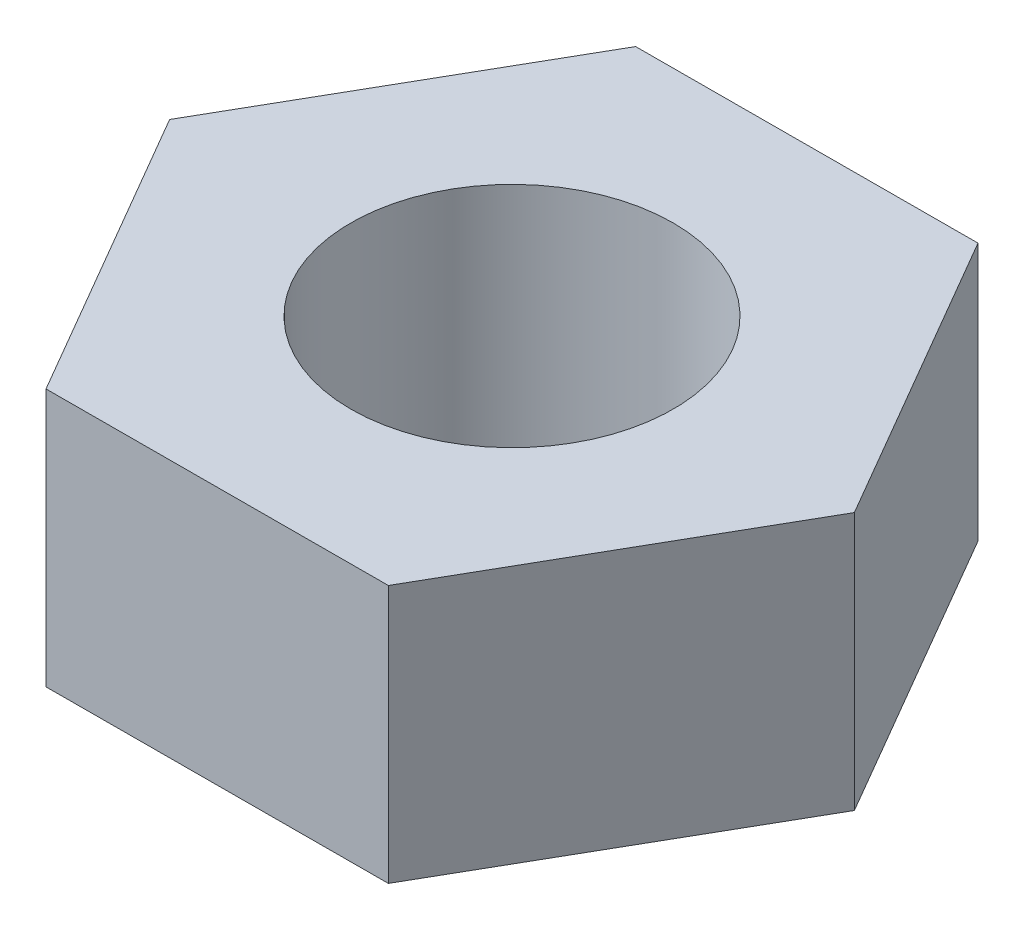
ISO-10303-21;
HEADER;
FILE_DESCRIPTION(('STEP AP214'),'2;1');
FILE_NAME('part.step','',(''),(''),'','','');
FILE_SCHEMA(('AUTOMOTIVE_DESIGN { 1 0 10303 214 1 1 1 1 }'));
ENDSEC;
DATA;
#1=APPLICATION_CONTEXT('core data for automotive mechanical design processes');
#2=APPLICATION_PROTOCOL_DEFINITION('international standard','automotive_design',2000,#1);
#3=PRODUCT_CONTEXT('',#1,'mechanical');
#4=PRODUCT('Part','Part','',(#3));
#5=PRODUCT_RELATED_PRODUCT_CATEGORY('part','',(#4));
#6=PRODUCT_DEFINITION_FORMATION('','',#4);
#7=PRODUCT_DEFINITION_CONTEXT('part definition',#1,'design');
#8=PRODUCT_DEFINITION('design','',#6,#7);
#9=PRODUCT_DEFINITION_SHAPE('','',#8);
#10=(LENGTH_UNIT() NAMED_UNIT(*) SI_UNIT(.MILLI.,.METRE.));
#11=(NAMED_UNIT(*) PLANE_ANGLE_UNIT() SI_UNIT($,.RADIAN.));
#12=(NAMED_UNIT(*) SI_UNIT($,.STERADIAN.) SOLID_ANGLE_UNIT());
#13=UNCERTAINTY_MEASURE_WITH_UNIT(LENGTH_MEASURE(1.E-05),#10,'distance_accuracy_value','');
#14=(GEOMETRIC_REPRESENTATION_CONTEXT(3) GLOBAL_UNCERTAINTY_ASSIGNED_CONTEXT((#13)) GLOBAL_UNIT_ASSIGNED_CONTEXT((#10,
#11,#12)) REPRESENTATION_CONTEXT('',''));
#15=CARTESIAN_POINT('',(0.,0.,0.));
#16=DIRECTION('',(0.,0.,1.));
#17=DIRECTION('',(1.,0.,0.));
#18=AXIS2_PLACEMENT_3D('',#15,#16,#17);
#19=CARTESIAN_POINT('',(0.,2.4,0.));
#20=DIRECTION('',(0.,1.,0.));
#21=DIRECTION('',(0.,0.,1.));
#22=AXIS2_PLACEMENT_3D('',#19,#20,#21);
#23=PLANE('',#22);
#24=DIRECTION('',(0.999995939069739,0.,-0.00284988491528015));
#25=VECTOR('',#24,1.);
#26=CARTESIAN_POINT('',(-1.57986960916171,2.4,2.75451363245502));
#27=LINE('',#26,#25);
#28=CARTESIAN_POINT('',(-1.57986960916171,2.4,2.75451363245502));
#29=VERTEX_POINT('',#28);
#30=CARTESIAN_POINT('',(1.59554397619575,2.4,2.74546403242854));
#31=VERTEX_POINT('',#30);
#32=EDGE_CURVE('E149',#29,#31,#27,.T.);
#33=ORIENTED_EDGE('',*,*,#32,.T.);
#34=DIRECTION('',(0.497529896800375,0.,-0.86744682937331));
#35=VECTOR('',#34,1.);
#36=CARTESIAN_POINT('',(1.59554397619575,2.4,2.74546403242854));
#37=LINE('',#36,#35);
#38=CARTESIAN_POINT('',(3.17541358535746,2.4,-0.00904960002648094));
#39=VERTEX_POINT('',#38);
#40=EDGE_CURVE('E97',#31,#39,#37,.T.);
#41=ORIENTED_EDGE('',*,*,#40,.T.);
#42=DIRECTION('',(-0.502466042269364,0.,-0.86459694445803));
#43=VECTOR('',#42,1.);
#44=CARTESIAN_POINT('',(3.17541358535746,2.4,-0.00904960002648094));
#45=LINE('',#44,#43);
#46=CARTESIAN_POINT('',(1.57986960916171,2.4,-2.75451363245502));
#47=VERTEX_POINT('',#46);
#48=EDGE_CURVE('E110',#39,#47,#45,.T.);
#49=ORIENTED_EDGE('',*,*,#48,.T.);
#50=DIRECTION('',(-0.999995939069739,0.,0.00284988491528015));
#51=VECTOR('',#50,1.);
#52=CARTESIAN_POINT('',(1.57986960916171,2.4,-2.75451363245502));
#53=LINE('',#52,#51);
#54=CARTESIAN_POINT('',(-1.59554397619575,2.4,-2.74546403242854));
#55=VERTEX_POINT('',#54);
#56=EDGE_CURVE('E104',#47,#55,#53,.T.);
#57=ORIENTED_EDGE('',*,*,#56,.T.);
#58=DIRECTION('',(-0.497529896800375,0.,0.86744682937331));
#59=VECTOR('',#58,1.);
#60=CARTESIAN_POINT('',(-1.59554397619575,2.4,-2.74546403242854));
#61=LINE('',#60,#59);
#62=CARTESIAN_POINT('',(-3.17541358535745,2.4,0.00904960002648013));
#63=VERTEX_POINT('',#62);
#64=EDGE_CURVE('E108',#55,#63,#61,.T.);
#65=ORIENTED_EDGE('',*,*,#64,.T.);
#66=DIRECTION('',(0.502466042269364,0.,0.86459694445803));
#67=VECTOR('',#66,1.);
#68=CARTESIAN_POINT('',(-3.17541358535745,2.4,0.00904960002648013));
#69=LINE('',#68,#67);
#70=EDGE_CURVE('E60',#63,#29,#69,.T.);
#71=ORIENTED_EDGE('',*,*,#70,.T.);
#72=EDGE_LOOP('',(#33,#41,#49,#57,#65,#71));
#73=FACE_BOUND('',#72,.T.);
#74=CARTESIAN_POINT('',(0.,2.4,0.));
#75=DIRECTION('',(0.,1.,0.));
#76=DIRECTION('',(0.,0.,1.));
#77=AXIS2_PLACEMENT_3D('',#74,#75,#76);
#78=CIRCLE('',#77,1.5);
#79=CARTESIAN_POINT('',(0.,2.4,1.5));
#80=VERTEX_POINT('',#79);
#81=EDGE_CURVE('E137',#80,#80,#78,.T.);
#82=ORIENTED_EDGE('',*,*,#81,.F.);
#83=EDGE_LOOP('',(#82));
#84=FACE_BOUND('',#83,.T.);
#85=ADVANCED_FACE('F42',(#73,#84),#23,.T.);
#86=CARTESIAN_POINT('',(0.,0.,0.));
#87=DIRECTION('',(0.,1.,0.));
#88=DIRECTION('',(0.,0.,1.));
#89=AXIS2_PLACEMENT_3D('',#86,#87,#88);
#90=PLANE('',#89);
#91=DIRECTION('',(0.999995939069739,0.,-0.00284988491528015));
#92=VECTOR('',#91,1.);
#93=CARTESIAN_POINT('',(-1.57986960916171,0.,2.75451363245502));
#94=LINE('',#93,#92);
#95=CARTESIAN_POINT('',(-1.57986960916171,0.,2.75451363245502));
#96=VERTEX_POINT('',#95);
#97=CARTESIAN_POINT('',(1.59554397619575,0.,2.74546403242854));
#98=VERTEX_POINT('',#97);
#99=EDGE_CURVE('E132',#96,#98,#94,.T.);
#100=ORIENTED_EDGE('',*,*,#99,.F.);
#101=DIRECTION('',(0.502466042269364,0.,0.86459694445803));
#102=VECTOR('',#101,1.);
#103=CARTESIAN_POINT('',(-3.17541358535745,0.,0.00904960002648013));
#104=LINE('',#103,#102);
#105=CARTESIAN_POINT('',(-3.17541358535745,0.,0.00904960002648013));
#106=VERTEX_POINT('',#105);
#107=EDGE_CURVE('E89',#106,#96,#104,.T.);
#108=ORIENTED_EDGE('',*,*,#107,.F.);
#109=DIRECTION('',(-0.497529896800375,0.,0.86744682937331));
#110=VECTOR('',#109,1.);
#111=CARTESIAN_POINT('',(-1.59554397619575,0.,-2.74546403242854));
#112=LINE('',#111,#110);
#113=CARTESIAN_POINT('',(-1.59554397619575,0.,-2.74546403242854));
#114=VERTEX_POINT('',#113);
#115=EDGE_CURVE('E83',#114,#106,#112,.T.);
#116=ORIENTED_EDGE('',*,*,#115,.F.);
#117=DIRECTION('',(-0.999995939069739,0.,0.00284988491528015));
#118=VECTOR('',#117,1.);
#119=CARTESIAN_POINT('',(1.57986960916171,0.,-2.75451363245502));
#120=LINE('',#119,#118);
#121=CARTESIAN_POINT('',(1.57986960916171,0.,-2.75451363245502));
#122=VERTEX_POINT('',#121);
#123=EDGE_CURVE('E119',#122,#114,#120,.T.);
#124=ORIENTED_EDGE('',*,*,#123,.F.);
#125=DIRECTION('',(-0.502466042269364,0.,-0.86459694445803));
#126=VECTOR('',#125,1.);
#127=CARTESIAN_POINT('',(3.17541358535746,0.,-0.00904960002648094));
#128=LINE('',#127,#126);
#129=CARTESIAN_POINT('',(3.17541358535746,0.,-0.00904960002648094));
#130=VERTEX_POINT('',#129);
#131=EDGE_CURVE('E140',#130,#122,#128,.T.);
#132=ORIENTED_EDGE('',*,*,#131,.F.);
#133=DIRECTION('',(0.497529896800375,0.,-0.86744682937331));
#134=VECTOR('',#133,1.);
#135=CARTESIAN_POINT('',(1.59554397619575,0.,2.74546403242854));
#136=LINE('',#135,#134);
#137=EDGE_CURVE('E136',#98,#130,#136,.T.);
#138=ORIENTED_EDGE('',*,*,#137,.F.);
#139=EDGE_LOOP('',(#100,#108,#116,#124,#132,#138));
#140=FACE_BOUND('',#139,.T.);
#141=CARTESIAN_POINT('',(0.,0.,0.));
#142=DIRECTION('',(0.,1.,0.));
#143=DIRECTION('',(0.,0.,1.));
#144=AXIS2_PLACEMENT_3D('',#141,#142,#143);
#145=CIRCLE('',#144,1.5);
#146=CARTESIAN_POINT('',(0.,0.,1.5));
#147=VERTEX_POINT('',#146);
#148=EDGE_CURVE('E264',#147,#147,#145,.T.);
#149=ORIENTED_EDGE('',*,*,#148,.T.);
#150=EDGE_LOOP('',(#149));
#151=FACE_BOUND('',#150,.T.);
#152=ADVANCED_FACE('F162',(#140,#151),#90,.F.);
#153=CARTESIAN_POINT('',(-1.57986960916171,2.4,2.75451363245502));
#154=DIRECTION('',(-0.00284988491528015,0.,-0.999995939069739));
#155=DIRECTION('',(-0.999995939069739,0.,0.00284988491528015));
#156=AXIS2_PLACEMENT_3D('',#153,#154,#155);
#157=PLANE('',#156);
#158=ORIENTED_EDGE('',*,*,#99,.T.);
#159=DIRECTION('',(0.,-1.,0.));
#160=VECTOR('',#159,1.);
#161=CARTESIAN_POINT('',(1.59554397619575,2.4,2.74546403242854));
#162=LINE('',#161,#160);
#163=EDGE_CURVE('E11',#31,#98,#162,.T.);
#164=ORIENTED_EDGE('',*,*,#163,.F.);
#165=ORIENTED_EDGE('',*,*,#32,.F.);
#166=DIRECTION('',(0.,-1.,0.));
#167=VECTOR('',#166,1.);
#168=CARTESIAN_POINT('',(-1.57986960916171,2.4,2.75451363245502));
#169=LINE('',#168,#167);
#170=EDGE_CURVE('E128',#29,#96,#169,.T.);
#171=ORIENTED_EDGE('',*,*,#170,.T.);
#172=EDGE_LOOP('',(#158,#164,#165,#171));
#173=FACE_BOUND('',#172,.T.);
#174=ADVANCED_FACE('F44',(#173),#157,.F.);
#175=CARTESIAN_POINT('',(1.59554397619575,2.4,2.74546403242854));
#176=DIRECTION('',(-0.86744682937331,0.,-0.497529896800375));
#177=DIRECTION('',(-0.497529896800375,0.,0.86744682937331));
#178=AXIS2_PLACEMENT_3D('',#175,#176,#177);
#179=PLANE('',#178);
#180=ORIENTED_EDGE('',*,*,#137,.T.);
#181=DIRECTION('',(0.,-1.,0.));
#182=VECTOR('',#181,1.);
#183=CARTESIAN_POINT('',(3.17541358535746,2.4,-0.00904960002648094));
#184=LINE('',#183,#182);
#185=EDGE_CURVE('E52',#39,#130,#184,.T.);
#186=ORIENTED_EDGE('',*,*,#185,.F.);
#187=ORIENTED_EDGE('',*,*,#40,.F.);
#188=ORIENTED_EDGE('',*,*,#163,.T.);
#189=EDGE_LOOP('',(#180,#186,#187,#188));
#190=FACE_BOUND('',#189,.T.);
#191=ADVANCED_FACE('F187',(#190),#179,.F.);
#192=CARTESIAN_POINT('',(3.17541358535746,2.4,-0.00904960002648094));
#193=DIRECTION('',(-0.86459694445803,0.,0.502466042269364));
#194=DIRECTION('',(0.502466042269364,0.,0.86459694445803));
#195=AXIS2_PLACEMENT_3D('',#192,#193,#194);
#196=PLANE('',#195);
#197=ORIENTED_EDGE('',*,*,#131,.T.);
#198=DIRECTION('',(0.,-1.,0.));
#199=VECTOR('',#198,1.);
#200=CARTESIAN_POINT('',(1.57986960916171,2.4,-2.75451363245502));
#201=LINE('',#200,#199);
#202=EDGE_CURVE('E121',#47,#122,#201,.T.);
#203=ORIENTED_EDGE('',*,*,#202,.F.);
#204=ORIENTED_EDGE('',*,*,#48,.F.);
#205=ORIENTED_EDGE('',*,*,#185,.T.);
#206=EDGE_LOOP('',(#197,#203,#204,#205));
#207=FACE_BOUND('',#206,.T.);
#208=ADVANCED_FACE('F159',(#207),#196,.F.);
#209=CARTESIAN_POINT('',(1.57986960916171,2.4,-2.75451363245502));
#210=DIRECTION('',(0.00284988491528015,0.,0.999995939069739));
#211=DIRECTION('',(0.999995939069739,0.,-0.00284988491528015));
#212=AXIS2_PLACEMENT_3D('',#209,#210,#211);
#213=PLANE('',#212);
#214=ORIENTED_EDGE('',*,*,#123,.T.);
#215=DIRECTION('',(0.,-1.,0.));
#216=VECTOR('',#215,1.);
#217=CARTESIAN_POINT('',(-1.59554397619575,2.4,-2.74546403242854));
#218=LINE('',#217,#216);
#219=EDGE_CURVE('E116',#55,#114,#218,.T.);
#220=ORIENTED_EDGE('',*,*,#219,.F.);
#221=ORIENTED_EDGE('',*,*,#56,.F.);
#222=ORIENTED_EDGE('',*,*,#202,.T.);
#223=EDGE_LOOP('',(#214,#220,#221,#222));
#224=FACE_BOUND('',#223,.T.);
#225=ADVANCED_FACE('F117',(#224),#213,.F.);
#226=CARTESIAN_POINT('',(-1.59554397619575,2.4,-2.74546403242854));
#227=DIRECTION('',(0.86744682937331,0.,0.497529896800375));
#228=DIRECTION('',(0.497529896800375,0.,-0.86744682937331));
#229=AXIS2_PLACEMENT_3D('',#226,#227,#228);
#230=PLANE('',#229);
#231=ORIENTED_EDGE('',*,*,#115,.T.);
#232=DIRECTION('',(0.,-1.,0.));
#233=VECTOR('',#232,1.);
#234=CARTESIAN_POINT('',(-3.17541358535745,2.4,0.00904960002648013));
#235=LINE('',#234,#233);
#236=EDGE_CURVE('E122',#63,#106,#235,.T.);
#237=ORIENTED_EDGE('',*,*,#236,.F.);
#238=ORIENTED_EDGE('',*,*,#64,.F.);
#239=ORIENTED_EDGE('',*,*,#219,.T.);
#240=EDGE_LOOP('',(#231,#237,#238,#239));
#241=FACE_BOUND('',#240,.T.);
#242=ADVANCED_FACE('F124',(#241),#230,.F.);
#243=CARTESIAN_POINT('',(-3.17541358535745,2.4,0.00904960002648013));
#244=DIRECTION('',(0.86459694445803,0.,-0.502466042269364));
#245=DIRECTION('',(-0.502466042269364,0.,-0.86459694445803));
#246=AXIS2_PLACEMENT_3D('',#243,#244,#245);
#247=PLANE('',#246);
#248=ORIENTED_EDGE('',*,*,#107,.T.);
#249=ORIENTED_EDGE('',*,*,#170,.F.);
#250=ORIENTED_EDGE('',*,*,#70,.F.);
#251=ORIENTED_EDGE('',*,*,#236,.T.);
#252=EDGE_LOOP('',(#248,#249,#250,#251));
#253=FACE_BOUND('',#252,.T.);
#254=ADVANCED_FACE('F167',(#253),#247,.F.);
#255=CARTESIAN_POINT('',(0.,2.4,0.));
#256=DIRECTION('',(0.,-1.,0.));
#257=DIRECTION('',(0.,0.,-1.));
#258=AXIS2_PLACEMENT_3D('',#255,#256,#257);
#259=CYLINDRICAL_SURFACE('',#258,1.5);
#260=ORIENTED_EDGE('',*,*,#81,.T.);
#261=EDGE_LOOP('',(#260));
#262=FACE_BOUND('',#261,.T.);
#263=ORIENTED_EDGE('',*,*,#148,.F.);
#264=EDGE_LOOP('',(#263));
#265=FACE_BOUND('',#264,.T.);
#266=ADVANCED_FACE('F169',(#262,#265),#259,.F.);
#267=CLOSED_SHELL('',(#85,#152,#174,#191,#208,#225,#242,#254,#266));
#268=MANIFOLD_SOLID_BREP('B2',#267);
#269=ADVANCED_BREP_SHAPE_REPRESENTATION('',(#18,#268),#14);
#270=SHAPE_DEFINITION_REPRESENTATION(#9,#269);
ENDSEC;
END-ISO-10303-21;
